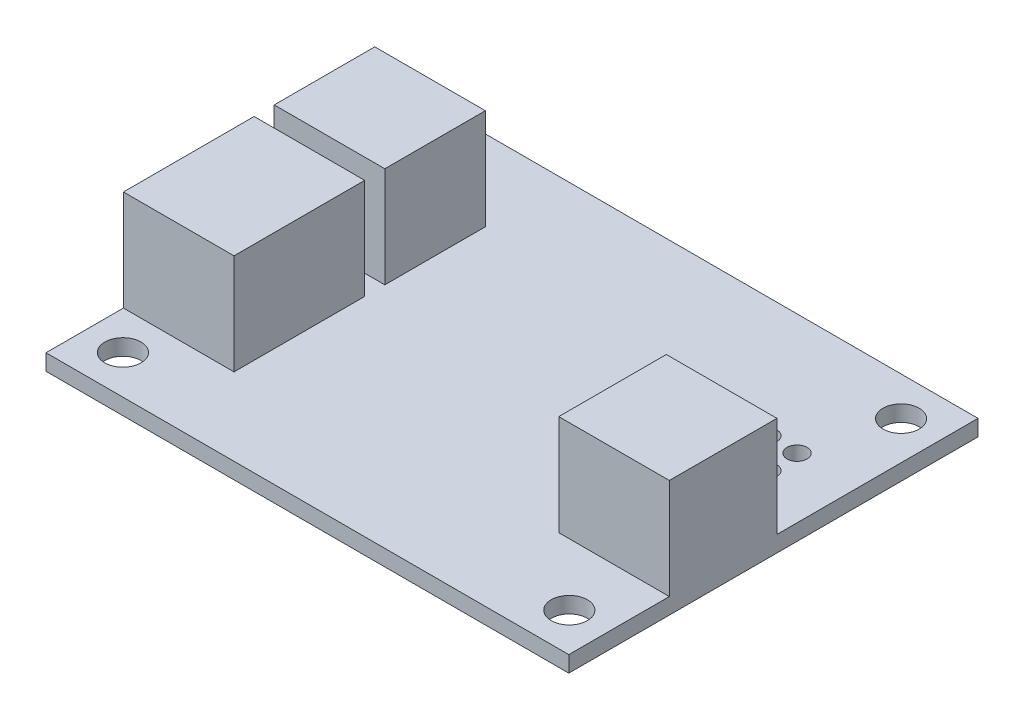
ISO-10303-21;
HEADER;
FILE_DESCRIPTION(('STEP AP214'),'2;1');
FILE_NAME('part.step','',(''),(''),'','','');
FILE_SCHEMA(('AUTOMOTIVE_DESIGN { 1 0 10303 214 1 1 1 1 }'));
ENDSEC;
DATA;
#1=APPLICATION_CONTEXT('core data for automotive mechanical design processes');
#2=APPLICATION_PROTOCOL_DEFINITION('international standard','automotive_design',2000,#1);
#3=PRODUCT_CONTEXT('',#1,'mechanical');
#4=PRODUCT('Part','Part','',(#3));
#5=PRODUCT_RELATED_PRODUCT_CATEGORY('part','',(#4));
#6=PRODUCT_DEFINITION_FORMATION('','',#4);
#7=PRODUCT_DEFINITION_CONTEXT('part definition',#1,'design');
#8=PRODUCT_DEFINITION('design','',#6,#7);
#9=PRODUCT_DEFINITION_SHAPE('','',#8);
#10=(LENGTH_UNIT() NAMED_UNIT(*) SI_UNIT(.MILLI.,.METRE.));
#11=(NAMED_UNIT(*) PLANE_ANGLE_UNIT() SI_UNIT($,.RADIAN.));
#12=(NAMED_UNIT(*) SI_UNIT($,.STERADIAN.) SOLID_ANGLE_UNIT());
#13=UNCERTAINTY_MEASURE_WITH_UNIT(LENGTH_MEASURE(1.E-05),#10,'distance_accuracy_value','');
#14=(GEOMETRIC_REPRESENTATION_CONTEXT(3) GLOBAL_UNCERTAINTY_ASSIGNED_CONTEXT((#13)) GLOBAL_UNIT_ASSIGNED_CONTEXT((#10,
#11,#12)) REPRESENTATION_CONTEXT('',''));
#15=CARTESIAN_POINT('',(0.,0.,0.));
#16=DIRECTION('',(0.,0.,1.));
#17=DIRECTION('',(1.,0.,0.));
#18=AXIS2_PLACEMENT_3D('',#15,#16,#17);
#19=CARTESIAN_POINT('',(0.,1.6,0.));
#20=DIRECTION('',(0.,-1.,0.));
#21=DIRECTION('',(0.,0.,-1.));
#22=AXIS2_PLACEMENT_3D('',#19,#20,#21);
#23=PLANE('',#22);
#24=CARTESIAN_POINT('',(46.,1.6,-28.7));
#25=DIRECTION('',(0.,1.,0.));
#26=DIRECTION('',(0.,0.,1.));
#27=AXIS2_PLACEMENT_3D('',#24,#25,#26);
#28=CIRCLE('',#27,0.999999999999998);
#29=CARTESIAN_POINT('',(46.,1.6,-27.7));
#30=VERTEX_POINT('',#29);
#31=EDGE_CURVE('E459',#30,#30,#28,.T.);
#32=ORIENTED_EDGE('',*,*,#31,.F.);
#33=EDGE_LOOP('',(#32));
#34=FACE_BOUND('',#33,.T.);
#35=CARTESIAN_POINT('',(40.,1.6,-28.7));
#36=DIRECTION('',(0.,1.,0.));
#37=DIRECTION('',(0.,0.,1.));
#38=AXIS2_PLACEMENT_3D('',#35,#36,#37);
#39=CIRCLE('',#38,0.999999999999998);
#40=CARTESIAN_POINT('',(40.,1.6,-27.7));
#41=VERTEX_POINT('',#40);
#42=EDGE_CURVE('E453',#41,#41,#39,.T.);
#43=ORIENTED_EDGE('',*,*,#42,.F.);
#44=EDGE_LOOP('',(#43));
#45=FACE_BOUND('',#44,.T.);
#46=CARTESIAN_POINT('',(43.,1.6,-28.7));
#47=DIRECTION('',(0.,1.,0.));
#48=DIRECTION('',(0.,0.,1.));
#49=AXIS2_PLACEMENT_3D('',#46,#47,#48);
#50=CIRCLE('',#49,0.999999999999998);
#51=CARTESIAN_POINT('',(43.,1.6,-27.7));
#52=VERTEX_POINT('',#51);
#53=EDGE_CURVE('E447',#52,#52,#50,.T.);
#54=ORIENTED_EDGE('',*,*,#53,.F.);
#55=EDGE_LOOP('',(#54));
#56=FACE_BOUND('',#55,.T.);
#57=CARTESIAN_POINT('',(40.,1.6,-25.7));
#58=DIRECTION('',(0.,1.,0.));
#59=DIRECTION('',(0.,0.,1.));
#60=AXIS2_PLACEMENT_3D('',#57,#58,#59);
#61=CIRCLE('',#60,0.999999999999998);
#62=CARTESIAN_POINT('',(40.,1.6,-24.7));
#63=VERTEX_POINT('',#62);
#64=EDGE_CURVE('E439',#63,#63,#61,.T.);
#65=ORIENTED_EDGE('',*,*,#64,.F.);
#66=EDGE_LOOP('',(#65));
#67=FACE_BOUND('',#66,.T.);
#68=CARTESIAN_POINT('',(43.,1.6,-25.7));
#69=DIRECTION('',(0.,1.,0.));
#70=DIRECTION('',(0.,0.,1.));
#71=AXIS2_PLACEMENT_3D('',#68,#69,#70);
#72=CIRCLE('',#71,0.999999999999998);
#73=CARTESIAN_POINT('',(43.,1.6,-24.7));
#74=VERTEX_POINT('',#73);
#75=EDGE_CURVE('E432',#74,#74,#72,.T.);
#76=ORIENTED_EDGE('',*,*,#75,.F.);
#77=EDGE_LOOP('',(#76));
#78=FACE_BOUND('',#77,.T.);
#79=CARTESIAN_POINT('',(46.,1.6,-25.7));
#80=DIRECTION('',(0.,1.,0.));
#81=DIRECTION('',(0.,0.,1.));
#82=AXIS2_PLACEMENT_3D('',#79,#80,#81);
#83=CIRCLE('',#82,0.999999999999998);
#84=CARTESIAN_POINT('',(46.,1.6,-24.7));
#85=VERTEX_POINT('',#84);
#86=EDGE_CURVE('E436',#85,#85,#83,.T.);
#87=ORIENTED_EDGE('',*,*,#86,.F.);
#88=EDGE_LOOP('',(#87));
#89=FACE_BOUND('',#88,.T.);
#90=CARTESIAN_POINT('',(3.8,1.6,-3.85));
#91=DIRECTION('',(0.,1.,0.));
#92=DIRECTION('',(0.,0.,1.));
#93=AXIS2_PLACEMENT_3D('',#90,#91,#92);
#94=CIRCLE('',#93,1.8);
#95=CARTESIAN_POINT('',(3.8,1.6,-2.05));
#96=VERTEX_POINT('',#95);
#97=EDGE_CURVE('E234',#96,#96,#94,.T.);
#98=ORIENTED_EDGE('',*,*,#97,.F.);
#99=EDGE_LOOP('',(#98));
#100=FACE_BOUND('',#99,.T.);
#101=CARTESIAN_POINT('',(48.2,1.6,-3.85));
#102=DIRECTION('',(0.,1.,0.));
#103=DIRECTION('',(0.,0.,1.));
#104=AXIS2_PLACEMENT_3D('',#101,#102,#103);
#105=CIRCLE('',#104,1.8);
#106=CARTESIAN_POINT('',(48.2,1.6,-2.05));
#107=VERTEX_POINT('',#106);
#108=EDGE_CURVE('E240',#107,#107,#105,.T.);
#109=ORIENTED_EDGE('',*,*,#108,.F.);
#110=EDGE_LOOP('',(#109));
#111=FACE_BOUND('',#110,.T.);
#112=CARTESIAN_POINT('',(48.2,1.6,-36.85));
#113=DIRECTION('',(0.,1.,0.));
#114=DIRECTION('',(0.,0.,1.));
#115=AXIS2_PLACEMENT_3D('',#112,#113,#114);
#116=CIRCLE('',#115,1.8);
#117=CARTESIAN_POINT('',(48.2,1.6,-35.05));
#118=VERTEX_POINT('',#117);
#119=EDGE_CURVE('E246',#118,#118,#116,.T.);
#120=ORIENTED_EDGE('',*,*,#119,.F.);
#121=EDGE_LOOP('',(#120));
#122=FACE_BOUND('',#121,.T.);
#123=CARTESIAN_POINT('',(3.8,1.6,-36.85));
#124=DIRECTION('',(0.,1.,0.));
#125=DIRECTION('',(0.,0.,1.));
#126=AXIS2_PLACEMENT_3D('',#123,#124,#125);
#127=CIRCLE('',#126,1.8);
#128=CARTESIAN_POINT('',(3.8,1.6,-35.05));
#129=VERTEX_POINT('',#128);
#130=EDGE_CURVE('E252',#129,#129,#127,.T.);
#131=ORIENTED_EDGE('',*,*,#130,.F.);
#132=EDGE_LOOP('',(#131));
#133=FACE_BOUND('',#132,.T.);
#134=DIRECTION('',(1.,0.,0.));
#135=VECTOR('',#134,1.);
#136=CARTESIAN_POINT('',(0.,1.6,-7.7));
#137=LINE('',#136,#135);
#138=CARTESIAN_POINT('',(0.,1.6,-7.7));
#139=VERTEX_POINT('',#138);
#140=CARTESIAN_POINT('',(11.,1.6,-7.7));
#141=VERTEX_POINT('',#140);
#142=EDGE_CURVE('E314',#139,#141,#137,.T.);
#143=ORIENTED_EDGE('',*,*,#142,.F.);
#144=DIRECTION('',(0.,0.,1.));
#145=VECTOR('',#144,1.);
#146=CARTESIAN_POINT('',(0.,1.6,0.));
#147=LINE('',#146,#145);
#148=CARTESIAN_POINT('',(0.,1.6,0.));
#149=VERTEX_POINT('',#148);
#150=EDGE_CURVE('E167',#139,#149,#147,.T.);
#151=ORIENTED_EDGE('',*,*,#150,.T.);
#152=DIRECTION('',(1.,0.,0.));
#153=VECTOR('',#152,1.);
#154=CARTESIAN_POINT('',(0.,1.6,0.));
#155=LINE('',#154,#153);
#156=CARTESIAN_POINT('',(52.,1.6,0.));
#157=VERTEX_POINT('',#156);
#158=EDGE_CURVE('E260',#149,#157,#155,.T.);
#159=ORIENTED_EDGE('',*,*,#158,.T.);
#160=DIRECTION('',(0.,0.,-1.));
#161=VECTOR('',#160,1.);
#162=CARTESIAN_POINT('',(52.,1.6,0.));
#163=LINE('',#162,#161);
#164=CARTESIAN_POINT('',(52.,1.6,-10.));
#165=VERTEX_POINT('',#164);
#166=EDGE_CURVE('E264',#157,#165,#163,.T.);
#167=ORIENTED_EDGE('',*,*,#166,.T.);
#168=DIRECTION('',(1.,0.,0.));
#169=VECTOR('',#168,1.);
#170=CARTESIAN_POINT('',(52.,1.6,-10.));
#171=LINE('',#170,#169);
#172=CARTESIAN_POINT('',(41.,1.6,-10.));
#173=VERTEX_POINT('',#172);
#174=EDGE_CURVE('E208',#173,#165,#171,.T.);
#175=ORIENTED_EDGE('',*,*,#174,.F.);
#176=DIRECTION('',(0.,0.,1.));
#177=VECTOR('',#176,1.);
#178=CARTESIAN_POINT('',(41.,1.6,-10.));
#179=LINE('',#178,#177);
#180=CARTESIAN_POINT('',(41.,1.6,-20.7));
#181=VERTEX_POINT('',#180);
#182=EDGE_CURVE('E217',#181,#173,#179,.T.);
#183=ORIENTED_EDGE('',*,*,#182,.F.);
#184=DIRECTION('',(-1.,0.,0.));
#185=VECTOR('',#184,1.);
#186=CARTESIAN_POINT('',(52.,1.6,-20.7));
#187=LINE('',#186,#185);
#188=CARTESIAN_POINT('',(52.,1.6,-20.7));
#189=VERTEX_POINT('',#188);
#190=EDGE_CURVE('E203',#189,#181,#187,.T.);
#191=ORIENTED_EDGE('',*,*,#190,.F.);
#192=CARTESIAN_POINT('',(52.,1.6,-40.7));
#193=VERTEX_POINT('',#192);
#194=EDGE_CURVE('E263',#189,#193,#163,.T.);
#195=ORIENTED_EDGE('',*,*,#194,.T.);
#196=DIRECTION('',(-1.,0.,0.));
#197=VECTOR('',#196,1.);
#198=CARTESIAN_POINT('',(0.,1.6,-40.7));
#199=LINE('',#198,#197);
#200=CARTESIAN_POINT('',(0.,1.6,-40.7));
#201=VERTEX_POINT('',#200);
#202=EDGE_CURVE('E266',#193,#201,#199,.T.);
#203=ORIENTED_EDGE('',*,*,#202,.T.);
#204=CARTESIAN_POINT('',(0.,1.6,-32.7));
#205=VERTEX_POINT('',#204);
#206=EDGE_CURVE('E258',#201,#205,#147,.T.);
#207=ORIENTED_EDGE('',*,*,#206,.T.);
#208=DIRECTION('',(-1.,0.,0.));
#209=VECTOR('',#208,1.);
#210=CARTESIAN_POINT('',(0.,1.6,-32.7));
#211=LINE('',#210,#209);
#212=CARTESIAN_POINT('',(11.,1.6,-32.7));
#213=VERTEX_POINT('',#212);
#214=EDGE_CURVE('E181',#213,#205,#211,.T.);
#215=ORIENTED_EDGE('',*,*,#214,.F.);
#216=DIRECTION('',(0.,0.,-1.));
#217=VECTOR('',#216,1.);
#218=CARTESIAN_POINT('',(11.,1.6,-32.7));
#219=LINE('',#218,#217);
#220=CARTESIAN_POINT('',(11.,1.6,-22.7));
#221=VERTEX_POINT('',#220);
#222=EDGE_CURVE('E171',#221,#213,#219,.T.);
#223=ORIENTED_EDGE('',*,*,#222,.F.);
#224=DIRECTION('',(1.,0.,0.));
#225=VECTOR('',#224,1.);
#226=CARTESIAN_POINT('',(0.,1.6,-22.7));
#227=LINE('',#226,#225);
#228=CARTESIAN_POINT('',(0.,1.6,-22.7));
#229=VERTEX_POINT('',#228);
#230=EDGE_CURVE('E168',#229,#221,#227,.T.);
#231=ORIENTED_EDGE('',*,*,#230,.F.);
#232=CARTESIAN_POINT('',(0.,1.6,-20.7));
#233=VERTEX_POINT('',#232);
#234=EDGE_CURVE('E261',#229,#233,#147,.T.);
#235=ORIENTED_EDGE('',*,*,#234,.T.);
#236=DIRECTION('',(-1.,0.,0.));
#237=VECTOR('',#236,1.);
#238=CARTESIAN_POINT('',(0.,1.6,-20.7));
#239=LINE('',#238,#237);
#240=CARTESIAN_POINT('',(11.,1.6,-20.7));
#241=VERTEX_POINT('',#240);
#242=EDGE_CURVE('E53',#241,#233,#239,.T.);
#243=ORIENTED_EDGE('',*,*,#242,.F.);
#244=DIRECTION('',(0.,0.,-1.));
#245=VECTOR('',#244,1.);
#246=CARTESIAN_POINT('',(11.,1.6,-20.7));
#247=LINE('',#246,#245);
#248=EDGE_CURVE('E48',#141,#241,#247,.T.);
#249=ORIENTED_EDGE('',*,*,#248,.F.);
#250=EDGE_LOOP('',(#143,#151,#159,#167,#175,#183,#191,#195,#203,#207,#215,#223,#231,#235,#243,#249));
#251=FACE_BOUND('',#250,.T.);
#252=ADVANCED_FACE('F33',(#34,#45,#56,#67,#78,#89,#100,#111,#122,#133,#251),#23,.F.);
#253=CARTESIAN_POINT('',(0.,0.,0.));
#254=DIRECTION('',(0.,-1.,0.));
#255=DIRECTION('',(0.,0.,-1.));
#256=AXIS2_PLACEMENT_3D('',#253,#254,#255);
#257=PLANE('',#256);
#258=CARTESIAN_POINT('',(46.,0.,-28.7));
#259=DIRECTION('',(0.,1.,0.));
#260=DIRECTION('',(0.,0.,1.));
#261=AXIS2_PLACEMENT_3D('',#258,#259,#260);
#262=CIRCLE('',#261,0.999999999999998);
#263=CARTESIAN_POINT('',(46.,0.,-27.7));
#264=VERTEX_POINT('',#263);
#265=EDGE_CURVE('E456',#264,#264,#262,.T.);
#266=ORIENTED_EDGE('',*,*,#265,.T.);
#267=EDGE_LOOP('',(#266));
#268=FACE_BOUND('',#267,.T.);
#269=CARTESIAN_POINT('',(40.,0.,-28.7));
#270=DIRECTION('',(0.,1.,0.));
#271=DIRECTION('',(0.,0.,1.));
#272=AXIS2_PLACEMENT_3D('',#269,#270,#271);
#273=CIRCLE('',#272,0.999999999999998);
#274=CARTESIAN_POINT('',(40.,0.,-27.7));
#275=VERTEX_POINT('',#274);
#276=EDGE_CURVE('E450',#275,#275,#273,.T.);
#277=ORIENTED_EDGE('',*,*,#276,.T.);
#278=EDGE_LOOP('',(#277));
#279=FACE_BOUND('',#278,.T.);
#280=CARTESIAN_POINT('',(43.,0.,-28.7));
#281=DIRECTION('',(0.,1.,0.));
#282=DIRECTION('',(0.,0.,1.));
#283=AXIS2_PLACEMENT_3D('',#280,#281,#282);
#284=CIRCLE('',#283,0.999999999999998);
#285=CARTESIAN_POINT('',(43.,0.,-27.7));
#286=VERTEX_POINT('',#285);
#287=EDGE_CURVE('E444',#286,#286,#284,.T.);
#288=ORIENTED_EDGE('',*,*,#287,.T.);
#289=EDGE_LOOP('',(#288));
#290=FACE_BOUND('',#289,.T.);
#291=CARTESIAN_POINT('',(40.,0.,-25.7));
#292=DIRECTION('',(0.,1.,0.));
#293=DIRECTION('',(0.,0.,1.));
#294=AXIS2_PLACEMENT_3D('',#291,#292,#293);
#295=CIRCLE('',#294,0.999999999999998);
#296=CARTESIAN_POINT('',(40.,0.,-24.7));
#297=VERTEX_POINT('',#296);
#298=EDGE_CURVE('E434',#297,#297,#295,.T.);
#299=ORIENTED_EDGE('',*,*,#298,.T.);
#300=EDGE_LOOP('',(#299));
#301=FACE_BOUND('',#300,.T.);
#302=CARTESIAN_POINT('',(43.,0.,-25.7));
#303=DIRECTION('',(0.,1.,0.));
#304=DIRECTION('',(0.,0.,1.));
#305=AXIS2_PLACEMENT_3D('',#302,#303,#304);
#306=CIRCLE('',#305,0.999999999999998);
#307=CARTESIAN_POINT('',(43.,0.,-24.7));
#308=VERTEX_POINT('',#307);
#309=EDGE_CURVE('E429',#308,#308,#306,.T.);
#310=ORIENTED_EDGE('',*,*,#309,.T.);
#311=EDGE_LOOP('',(#310));
#312=FACE_BOUND('',#311,.T.);
#313=CARTESIAN_POINT('',(46.,0.,-25.7));
#314=DIRECTION('',(0.,1.,0.));
#315=DIRECTION('',(0.,0.,1.));
#316=AXIS2_PLACEMENT_3D('',#313,#314,#315);
#317=CIRCLE('',#316,0.999999999999998);
#318=CARTESIAN_POINT('',(46.,0.,-24.7));
#319=VERTEX_POINT('',#318);
#320=EDGE_CURVE('E462',#319,#319,#317,.T.);
#321=ORIENTED_EDGE('',*,*,#320,.T.);
#322=EDGE_LOOP('',(#321));
#323=FACE_BOUND('',#322,.T.);
#324=CARTESIAN_POINT('',(48.2,0.,-3.85));
#325=DIRECTION('',(0.,1.,0.));
#326=DIRECTION('',(0.,0.,1.));
#327=AXIS2_PLACEMENT_3D('',#324,#325,#326);
#328=CIRCLE('',#327,1.8);
#329=CARTESIAN_POINT('',(48.2,0.,-2.05));
#330=VERTEX_POINT('',#329);
#331=EDGE_CURVE('E237',#330,#330,#328,.T.);
#332=ORIENTED_EDGE('',*,*,#331,.T.);
#333=EDGE_LOOP('',(#332));
#334=FACE_BOUND('',#333,.T.);
#335=CARTESIAN_POINT('',(3.8,0.,-36.85));
#336=DIRECTION('',(0.,1.,0.));
#337=DIRECTION('',(0.,0.,1.));
#338=AXIS2_PLACEMENT_3D('',#335,#336,#337);
#339=CIRCLE('',#338,1.8);
#340=CARTESIAN_POINT('',(3.8,0.,-35.05));
#341=VERTEX_POINT('',#340);
#342=EDGE_CURVE('E249',#341,#341,#339,.T.);
#343=ORIENTED_EDGE('',*,*,#342,.T.);
#344=EDGE_LOOP('',(#343));
#345=FACE_BOUND('',#344,.T.);
#346=DIRECTION('',(0.,0.,1.));
#347=VECTOR('',#346,1.);
#348=CARTESIAN_POINT('',(0.,0.,0.));
#349=LINE('',#348,#347);
#350=CARTESIAN_POINT('',(0.,0.,-40.7));
#351=VERTEX_POINT('',#350);
#352=CARTESIAN_POINT('',(0.,0.,0.));
#353=VERTEX_POINT('',#352);
#354=EDGE_CURVE('E255',#351,#353,#349,.T.);
#355=ORIENTED_EDGE('',*,*,#354,.F.);
#356=DIRECTION('',(-1.,0.,0.));
#357=VECTOR('',#356,1.);
#358=CARTESIAN_POINT('',(0.,0.,-40.7));
#359=LINE('',#358,#357);
#360=CARTESIAN_POINT('',(52.,0.,-40.7));
#361=VERTEX_POINT('',#360);
#362=EDGE_CURVE('E274',#361,#351,#359,.T.);
#363=ORIENTED_EDGE('',*,*,#362,.F.);
#364=DIRECTION('',(0.,0.,-1.));
#365=VECTOR('',#364,1.);
#366=CARTESIAN_POINT('',(52.,0.,0.));
#367=LINE('',#366,#365);
#368=CARTESIAN_POINT('',(52.,0.,0.));
#369=VERTEX_POINT('',#368);
#370=EDGE_CURVE('E272',#369,#361,#367,.T.);
#371=ORIENTED_EDGE('',*,*,#370,.F.);
#372=DIRECTION('',(1.,0.,0.));
#373=VECTOR('',#372,1.);
#374=CARTESIAN_POINT('',(0.,0.,0.));
#375=LINE('',#374,#373);
#376=EDGE_CURVE('E270',#353,#369,#375,.T.);
#377=ORIENTED_EDGE('',*,*,#376,.F.);
#378=EDGE_LOOP('',(#355,#363,#371,#377));
#379=FACE_BOUND('',#378,.T.);
#380=CARTESIAN_POINT('',(48.2,0.,-36.85));
#381=DIRECTION('',(0.,1.,0.));
#382=DIRECTION('',(0.,0.,1.));
#383=AXIS2_PLACEMENT_3D('',#380,#381,#382);
#384=CIRCLE('',#383,1.8);
#385=CARTESIAN_POINT('',(48.2,0.,-35.05));
#386=VERTEX_POINT('',#385);
#387=EDGE_CURVE('E243',#386,#386,#384,.T.);
#388=ORIENTED_EDGE('',*,*,#387,.T.);
#389=EDGE_LOOP('',(#388));
#390=FACE_BOUND('',#389,.T.);
#391=CARTESIAN_POINT('',(3.8,0.,-3.85));
#392=DIRECTION('',(0.,1.,0.));
#393=DIRECTION('',(0.,0.,1.));
#394=AXIS2_PLACEMENT_3D('',#391,#392,#393);
#395=CIRCLE('',#394,1.8);
#396=CARTESIAN_POINT('',(3.8,0.,-2.05));
#397=VERTEX_POINT('',#396);
#398=EDGE_CURVE('E233',#397,#397,#395,.T.);
#399=ORIENTED_EDGE('',*,*,#398,.T.);
#400=EDGE_LOOP('',(#399));
#401=FACE_BOUND('',#400,.T.);
#402=ADVANCED_FACE('F292',(#268,#279,#290,#301,#312,#323,#334,#345,#379,#390,#401),#257,.T.);
#403=CARTESIAN_POINT('',(0.,1.6,0.));
#404=DIRECTION('',(1.,0.,0.));
#405=DIRECTION('',(0.,0.,-1.));
#406=AXIS2_PLACEMENT_3D('',#403,#404,#405);
#407=PLANE('',#406);
#408=ORIENTED_EDGE('',*,*,#354,.T.);
#409=DIRECTION('',(0.,-1.,0.));
#410=VECTOR('',#409,1.);
#411=CARTESIAN_POINT('',(0.,1.6,0.));
#412=LINE('',#411,#410);
#413=EDGE_CURVE('E11',#149,#353,#412,.T.);
#414=ORIENTED_EDGE('',*,*,#413,.F.);
#415=ORIENTED_EDGE('',*,*,#150,.F.);
#416=DIRECTION('',(0.,-1.,0.));
#417=VECTOR('',#416,1.);
#418=CARTESIAN_POINT('',(0.,11.6,-7.7));
#419=LINE('',#418,#417);
#420=CARTESIAN_POINT('',(0.,11.6,-7.7));
#421=VERTEX_POINT('',#420);
#422=EDGE_CURVE('E149',#421,#139,#419,.T.);
#423=ORIENTED_EDGE('',*,*,#422,.F.);
#424=DIRECTION('',(0.,0.,1.));
#425=VECTOR('',#424,1.);
#426=CARTESIAN_POINT('',(0.,11.6,-20.7));
#427=LINE('',#426,#425);
#428=CARTESIAN_POINT('',(0.,11.6,-20.7));
#429=VERTEX_POINT('',#428);
#430=EDGE_CURVE('E155',#429,#421,#427,.T.);
#431=ORIENTED_EDGE('',*,*,#430,.F.);
#432=DIRECTION('',(0.,-1.,0.));
#433=VECTOR('',#432,1.);
#434=CARTESIAN_POINT('',(0.,11.6,-20.7));
#435=LINE('',#434,#433);
#436=EDGE_CURVE('E313',#429,#233,#435,.T.);
#437=ORIENTED_EDGE('',*,*,#436,.T.);
#438=ORIENTED_EDGE('',*,*,#234,.F.);
#439=DIRECTION('',(0.,-1.,0.));
#440=VECTOR('',#439,1.);
#441=CARTESIAN_POINT('',(0.,11.6,-22.7));
#442=LINE('',#441,#440);
#443=CARTESIAN_POINT('',(0.,11.6,-22.7));
#444=VERTEX_POINT('',#443);
#445=EDGE_CURVE('E200',#444,#229,#442,.T.);
#446=ORIENTED_EDGE('',*,*,#445,.F.);
#447=DIRECTION('',(0.,0.,1.));
#448=VECTOR('',#447,1.);
#449=CARTESIAN_POINT('',(0.,11.6,-32.7));
#450=LINE('',#449,#448);
#451=CARTESIAN_POINT('',(0.,11.6,-32.7));
#452=VERTEX_POINT('',#451);
#453=EDGE_CURVE('E177',#452,#444,#450,.T.);
#454=ORIENTED_EDGE('',*,*,#453,.F.);
#455=DIRECTION('',(0.,-1.,0.));
#456=VECTOR('',#455,1.);
#457=CARTESIAN_POINT('',(0.,11.6,-32.7));
#458=LINE('',#457,#456);
#459=EDGE_CURVE('E186',#452,#205,#458,.T.);
#460=ORIENTED_EDGE('',*,*,#459,.T.);
#461=ORIENTED_EDGE('',*,*,#206,.F.);
#462=DIRECTION('',(0.,-1.,0.));
#463=VECTOR('',#462,1.);
#464=CARTESIAN_POINT('',(0.,1.6,-40.7));
#465=LINE('',#464,#463);
#466=EDGE_CURVE('E268',#201,#351,#465,.T.);
#467=ORIENTED_EDGE('',*,*,#466,.T.);
#468=EDGE_LOOP('',(#408,#414,#415,#423,#431,#437,#438,#446,#454,#460,#461,#467));
#469=FACE_BOUND('',#468,.T.);
#470=ADVANCED_FACE('F35',(#469),#407,.F.);
#471=CARTESIAN_POINT('',(0.,1.6,0.));
#472=DIRECTION('',(0.,0.,-1.));
#473=DIRECTION('',(-1.,0.,0.));
#474=AXIS2_PLACEMENT_3D('',#471,#472,#473);
#475=PLANE('',#474);
#476=ORIENTED_EDGE('',*,*,#376,.T.);
#477=DIRECTION('',(0.,-1.,0.));
#478=VECTOR('',#477,1.);
#479=CARTESIAN_POINT('',(52.,1.6,0.));
#480=LINE('',#479,#478);
#481=EDGE_CURVE('E41',#157,#369,#480,.T.);
#482=ORIENTED_EDGE('',*,*,#481,.F.);
#483=ORIENTED_EDGE('',*,*,#158,.F.);
#484=ORIENTED_EDGE('',*,*,#413,.T.);
#485=EDGE_LOOP('',(#476,#482,#483,#484));
#486=FACE_BOUND('',#485,.T.);
#487=ADVANCED_FACE('F315',(#486),#475,.F.);
#488=CARTESIAN_POINT('',(52.,1.6,0.));
#489=DIRECTION('',(-1.,0.,0.));
#490=DIRECTION('',(0.,0.,1.));
#491=AXIS2_PLACEMENT_3D('',#488,#489,#490);
#492=PLANE('',#491);
#493=ORIENTED_EDGE('',*,*,#370,.T.);
#494=DIRECTION('',(0.,-1.,0.));
#495=VECTOR('',#494,1.);
#496=CARTESIAN_POINT('',(52.,1.6,-40.7));
#497=LINE('',#496,#495);
#498=EDGE_CURVE('E278',#193,#361,#497,.T.);
#499=ORIENTED_EDGE('',*,*,#498,.F.);
#500=ORIENTED_EDGE('',*,*,#194,.F.);
#501=DIRECTION('',(0.,-1.,0.));
#502=VECTOR('',#501,1.);
#503=CARTESIAN_POINT('',(52.,11.6,-20.7));
#504=LINE('',#503,#502);
#505=CARTESIAN_POINT('',(52.,11.6,-20.7));
#506=VERTEX_POINT('',#505);
#507=EDGE_CURVE('E230',#506,#189,#504,.T.);
#508=ORIENTED_EDGE('',*,*,#507,.F.);
#509=DIRECTION('',(0.,0.,-1.));
#510=VECTOR('',#509,1.);
#511=CARTESIAN_POINT('',(52.,11.6,-10.));
#512=LINE('',#511,#510);
#513=CARTESIAN_POINT('',(52.,11.6,-10.));
#514=VERTEX_POINT('',#513);
#515=EDGE_CURVE('E204',#514,#506,#512,.T.);
#516=ORIENTED_EDGE('',*,*,#515,.F.);
#517=DIRECTION('',(0.,-1.,0.));
#518=VECTOR('',#517,1.);
#519=CARTESIAN_POINT('',(52.,11.6,-10.));
#520=LINE('',#519,#518);
#521=EDGE_CURVE('E214',#514,#165,#520,.T.);
#522=ORIENTED_EDGE('',*,*,#521,.T.);
#523=ORIENTED_EDGE('',*,*,#166,.F.);
#524=ORIENTED_EDGE('',*,*,#481,.T.);
#525=EDGE_LOOP('',(#493,#499,#500,#508,#516,#522,#523,#524));
#526=FACE_BOUND('',#525,.T.);
#527=ADVANCED_FACE('F285',(#526),#492,.F.);
#528=CARTESIAN_POINT('',(0.,1.6,-40.7));
#529=DIRECTION('',(0.,0.,1.));
#530=DIRECTION('',(1.,0.,0.));
#531=AXIS2_PLACEMENT_3D('',#528,#529,#530);
#532=PLANE('',#531);
#533=ORIENTED_EDGE('',*,*,#362,.T.);
#534=ORIENTED_EDGE('',*,*,#466,.F.);
#535=ORIENTED_EDGE('',*,*,#202,.F.);
#536=ORIENTED_EDGE('',*,*,#498,.T.);
#537=EDGE_LOOP('',(#533,#534,#535,#536));
#538=FACE_BOUND('',#537,.T.);
#539=ADVANCED_FACE('F296',(#538),#532,.F.);
#540=CARTESIAN_POINT('',(3.8,1.6,-36.85));
#541=DIRECTION('',(0.,-1.,0.));
#542=DIRECTION('',(0.,0.,-1.));
#543=AXIS2_PLACEMENT_3D('',#540,#541,#542);
#544=CYLINDRICAL_SURFACE('',#543,1.8);
#545=ORIENTED_EDGE('',*,*,#130,.T.);
#546=EDGE_LOOP('',(#545));
#547=FACE_BOUND('',#546,.T.);
#548=ORIENTED_EDGE('',*,*,#342,.F.);
#549=EDGE_LOOP('',(#548));
#550=FACE_BOUND('',#549,.T.);
#551=ADVANCED_FACE('F333',(#547,#550),#544,.F.);
#552=CARTESIAN_POINT('',(48.2,1.6,-36.85));
#553=DIRECTION('',(0.,-1.,0.));
#554=DIRECTION('',(0.,0.,-1.));
#555=AXIS2_PLACEMENT_3D('',#552,#553,#554);
#556=CYLINDRICAL_SURFACE('',#555,1.8);
#557=ORIENTED_EDGE('',*,*,#119,.T.);
#558=EDGE_LOOP('',(#557));
#559=FACE_BOUND('',#558,.T.);
#560=ORIENTED_EDGE('',*,*,#387,.F.);
#561=EDGE_LOOP('',(#560));
#562=FACE_BOUND('',#561,.T.);
#563=ADVANCED_FACE('F340',(#559,#562),#556,.F.);
#564=CARTESIAN_POINT('',(48.2,1.6,-3.85));
#565=DIRECTION('',(0.,-1.,0.));
#566=DIRECTION('',(0.,0.,-1.));
#567=AXIS2_PLACEMENT_3D('',#564,#565,#566);
#568=CYLINDRICAL_SURFACE('',#567,1.8);
#569=ORIENTED_EDGE('',*,*,#108,.T.);
#570=EDGE_LOOP('',(#569));
#571=FACE_BOUND('',#570,.T.);
#572=ORIENTED_EDGE('',*,*,#331,.F.);
#573=EDGE_LOOP('',(#572));
#574=FACE_BOUND('',#573,.T.);
#575=ADVANCED_FACE('F345',(#571,#574),#568,.F.);
#576=CARTESIAN_POINT('',(3.8,1.6,-3.85));
#577=DIRECTION('',(0.,-1.,0.));
#578=DIRECTION('',(0.,0.,-1.));
#579=AXIS2_PLACEMENT_3D('',#576,#577,#578);
#580=CYLINDRICAL_SURFACE('',#579,1.8);
#581=ORIENTED_EDGE('',*,*,#97,.T.);
#582=EDGE_LOOP('',(#581));
#583=FACE_BOUND('',#582,.T.);
#584=ORIENTED_EDGE('',*,*,#398,.F.);
#585=EDGE_LOOP('',(#584));
#586=FACE_BOUND('',#585,.T.);
#587=ADVANCED_FACE('F355',(#583,#586),#580,.F.);
#588=CARTESIAN_POINT('',(52.,11.6,-20.7));
#589=DIRECTION('',(0.,0.,1.));
#590=DIRECTION('',(1.,0.,0.));
#591=AXIS2_PLACEMENT_3D('',#588,#589,#590);
#592=PLANE('',#591);
#593=ORIENTED_EDGE('',*,*,#190,.T.);
#594=DIRECTION('',(0.,-1.,0.));
#595=VECTOR('',#594,1.);
#596=CARTESIAN_POINT('',(41.,11.6,-20.7));
#597=LINE('',#596,#595);
#598=CARTESIAN_POINT('',(41.,11.6,-20.7));
#599=VERTEX_POINT('',#598);
#600=EDGE_CURVE('E227',#599,#181,#597,.T.);
#601=ORIENTED_EDGE('',*,*,#600,.F.);
#602=DIRECTION('',(-1.,0.,0.));
#603=VECTOR('',#602,1.);
#604=CARTESIAN_POINT('',(52.,11.6,-20.7));
#605=LINE('',#604,#603);
#606=EDGE_CURVE('E207',#506,#599,#605,.T.);
#607=ORIENTED_EDGE('',*,*,#606,.F.);
#608=ORIENTED_EDGE('',*,*,#507,.T.);
#609=EDGE_LOOP('',(#593,#601,#607,#608));
#610=FACE_BOUND('',#609,.T.);
#611=ADVANCED_FACE('F362',(#610),#592,.F.);
#612=CARTESIAN_POINT('',(41.,11.6,-10.));
#613=DIRECTION('',(1.,0.,0.));
#614=DIRECTION('',(0.,0.,-1.));
#615=AXIS2_PLACEMENT_3D('',#612,#613,#614);
#616=PLANE('',#615);
#617=ORIENTED_EDGE('',*,*,#182,.T.);
#618=DIRECTION('',(0.,-1.,0.));
#619=VECTOR('',#618,1.);
#620=CARTESIAN_POINT('',(41.,11.6,-10.));
#621=LINE('',#620,#619);
#622=CARTESIAN_POINT('',(41.,11.6,-10.));
#623=VERTEX_POINT('',#622);
#624=EDGE_CURVE('E224',#623,#173,#621,.T.);
#625=ORIENTED_EDGE('',*,*,#624,.F.);
#626=DIRECTION('',(0.,0.,1.));
#627=VECTOR('',#626,1.);
#628=CARTESIAN_POINT('',(41.,11.6,-10.));
#629=LINE('',#628,#627);
#630=EDGE_CURVE('E210',#599,#623,#629,.T.);
#631=ORIENTED_EDGE('',*,*,#630,.F.);
#632=ORIENTED_EDGE('',*,*,#600,.T.);
#633=EDGE_LOOP('',(#617,#625,#631,#632));
#634=FACE_BOUND('',#633,.T.);
#635=ADVANCED_FACE('F366',(#634),#616,.F.);
#636=CARTESIAN_POINT('',(52.,11.6,-10.));
#637=DIRECTION('',(0.,0.,-1.));
#638=DIRECTION('',(-1.,0.,0.));
#639=AXIS2_PLACEMENT_3D('',#636,#637,#638);
#640=PLANE('',#639);
#641=ORIENTED_EDGE('',*,*,#174,.T.);
#642=ORIENTED_EDGE('',*,*,#521,.F.);
#643=DIRECTION('',(1.,0.,0.));
#644=VECTOR('',#643,1.);
#645=CARTESIAN_POINT('',(52.,11.6,-10.));
#646=LINE('',#645,#644);
#647=EDGE_CURVE('E212',#623,#514,#646,.T.);
#648=ORIENTED_EDGE('',*,*,#647,.F.);
#649=ORIENTED_EDGE('',*,*,#624,.T.);
#650=EDGE_LOOP('',(#641,#642,#648,#649));
#651=FACE_BOUND('',#650,.T.);
#652=ADVANCED_FACE('F370',(#651),#640,.F.);
#653=CARTESIAN_POINT('',(0.,11.6,0.));
#654=DIRECTION('',(0.,1.,0.));
#655=DIRECTION('',(0.,0.,1.));
#656=AXIS2_PLACEMENT_3D('',#653,#654,#655);
#657=PLANE('',#656);
#658=ORIENTED_EDGE('',*,*,#515,.T.);
#659=ORIENTED_EDGE('',*,*,#606,.T.);
#660=ORIENTED_EDGE('',*,*,#630,.T.);
#661=ORIENTED_EDGE('',*,*,#647,.T.);
#662=EDGE_LOOP('',(#658,#659,#660,#661));
#663=FACE_BOUND('',#662,.T.);
#664=ADVANCED_FACE('F374',(#663),#657,.T.);
#665=CARTESIAN_POINT('',(0.,11.6,-22.7));
#666=DIRECTION('',(0.,0.,-1.));
#667=DIRECTION('',(-1.,0.,0.));
#668=AXIS2_PLACEMENT_3D('',#665,#666,#667);
#669=PLANE('',#668);
#670=ORIENTED_EDGE('',*,*,#230,.T.);
#671=DIRECTION('',(0.,-1.,0.));
#672=VECTOR('',#671,1.);
#673=CARTESIAN_POINT('',(11.,11.6,-22.7));
#674=LINE('',#673,#672);
#675=CARTESIAN_POINT('',(11.,11.6,-22.7));
#676=VERTEX_POINT('',#675);
#677=EDGE_CURVE('E197',#676,#221,#674,.T.);
#678=ORIENTED_EDGE('',*,*,#677,.F.);
#679=DIRECTION('',(1.,0.,0.));
#680=VECTOR('',#679,1.);
#681=CARTESIAN_POINT('',(0.,11.6,-22.7));
#682=LINE('',#681,#680);
#683=EDGE_CURVE('E180',#444,#676,#682,.T.);
#684=ORIENTED_EDGE('',*,*,#683,.F.);
#685=ORIENTED_EDGE('',*,*,#445,.T.);
#686=EDGE_LOOP('',(#670,#678,#684,#685));
#687=FACE_BOUND('',#686,.T.);
#688=ADVANCED_FACE('F311',(#687),#669,.F.);
#689=CARTESIAN_POINT('',(11.,11.6,-32.7));
#690=DIRECTION('',(-1.,0.,0.));
#691=DIRECTION('',(0.,0.,1.));
#692=AXIS2_PLACEMENT_3D('',#689,#690,#691);
#693=PLANE('',#692);
#694=ORIENTED_EDGE('',*,*,#222,.T.);
#695=DIRECTION('',(0.,-1.,0.));
#696=VECTOR('',#695,1.);
#697=CARTESIAN_POINT('',(11.,11.6,-32.7));
#698=LINE('',#697,#696);
#699=CARTESIAN_POINT('',(11.,11.6,-32.7));
#700=VERTEX_POINT('',#699);
#701=EDGE_CURVE('E194',#700,#213,#698,.T.);
#702=ORIENTED_EDGE('',*,*,#701,.F.);
#703=DIRECTION('',(0.,0.,-1.));
#704=VECTOR('',#703,1.);
#705=CARTESIAN_POINT('',(11.,11.6,-32.7));
#706=LINE('',#705,#704);
#707=EDGE_CURVE('E183',#676,#700,#706,.T.);
#708=ORIENTED_EDGE('',*,*,#707,.F.);
#709=ORIENTED_EDGE('',*,*,#677,.T.);
#710=EDGE_LOOP('',(#694,#702,#708,#709));
#711=FACE_BOUND('',#710,.T.);
#712=ADVANCED_FACE('F307',(#711),#693,.F.);
#713=CARTESIAN_POINT('',(0.,11.6,-32.7));
#714=DIRECTION('',(0.,0.,1.));
#715=DIRECTION('',(1.,0.,0.));
#716=AXIS2_PLACEMENT_3D('',#713,#714,#715);
#717=PLANE('',#716);
#718=ORIENTED_EDGE('',*,*,#214,.T.);
#719=ORIENTED_EDGE('',*,*,#459,.F.);
#720=DIRECTION('',(-1.,0.,0.));
#721=VECTOR('',#720,1.);
#722=CARTESIAN_POINT('',(0.,11.6,-32.7));
#723=LINE('',#722,#721);
#724=EDGE_CURVE('E185',#700,#452,#723,.T.);
#725=ORIENTED_EDGE('',*,*,#724,.F.);
#726=ORIENTED_EDGE('',*,*,#701,.T.);
#727=EDGE_LOOP('',(#718,#719,#725,#726));
#728=FACE_BOUND('',#727,.T.);
#729=ADVANCED_FACE('F302',(#728),#717,.F.);
#730=CARTESIAN_POINT('',(0.,11.6,0.));
#731=DIRECTION('',(0.,1.,0.));
#732=DIRECTION('',(0.,0.,1.));
#733=AXIS2_PLACEMENT_3D('',#730,#731,#732);
#734=PLANE('',#733);
#735=ORIENTED_EDGE('',*,*,#453,.T.);
#736=ORIENTED_EDGE('',*,*,#683,.T.);
#737=ORIENTED_EDGE('',*,*,#707,.T.);
#738=ORIENTED_EDGE('',*,*,#724,.T.);
#739=EDGE_LOOP('',(#735,#736,#737,#738));
#740=FACE_BOUND('',#739,.T.);
#741=ADVANCED_FACE('F385',(#740),#734,.T.);
#742=CARTESIAN_POINT('',(0.,11.6,-7.7));
#743=DIRECTION('',(0.,0.,-1.));
#744=DIRECTION('',(-1.,0.,0.));
#745=AXIS2_PLACEMENT_3D('',#742,#743,#744);
#746=PLANE('',#745);
#747=ORIENTED_EDGE('',*,*,#142,.T.);
#748=DIRECTION('',(0.,-1.,0.));
#749=VECTOR('',#748,1.);
#750=CARTESIAN_POINT('',(11.,11.6,-7.7));
#751=LINE('',#750,#749);
#752=CARTESIAN_POINT('',(11.,11.6,-7.7));
#753=VERTEX_POINT('',#752);
#754=EDGE_CURVE('E151',#753,#141,#751,.T.);
#755=ORIENTED_EDGE('',*,*,#754,.F.);
#756=DIRECTION('',(1.,0.,0.));
#757=VECTOR('',#756,1.);
#758=CARTESIAN_POINT('',(0.,11.6,-7.7));
#759=LINE('',#758,#757);
#760=EDGE_CURVE('E145',#421,#753,#759,.T.);
#761=ORIENTED_EDGE('',*,*,#760,.F.);
#762=ORIENTED_EDGE('',*,*,#422,.T.);
#763=EDGE_LOOP('',(#747,#755,#761,#762));
#764=FACE_BOUND('',#763,.T.);
#765=ADVANCED_FACE('F147',(#764),#746,.F.);
#766=CARTESIAN_POINT('',(11.,11.6,-20.7));
#767=DIRECTION('',(-1.,0.,0.));
#768=DIRECTION('',(0.,0.,1.));
#769=AXIS2_PLACEMENT_3D('',#766,#767,#768);
#770=PLANE('',#769);
#771=ORIENTED_EDGE('',*,*,#248,.T.);
#772=DIRECTION('',(0.,-1.,0.));
#773=VECTOR('',#772,1.);
#774=CARTESIAN_POINT('',(11.,11.6,-20.7));
#775=LINE('',#774,#773);
#776=CARTESIAN_POINT('',(11.,11.6,-20.7));
#777=VERTEX_POINT('',#776);
#778=EDGE_CURVE('E173',#777,#241,#775,.T.);
#779=ORIENTED_EDGE('',*,*,#778,.F.);
#780=DIRECTION('',(0.,0.,-1.));
#781=VECTOR('',#780,1.);
#782=CARTESIAN_POINT('',(11.,11.6,-20.7));
#783=LINE('',#782,#781);
#784=EDGE_CURVE('E154',#753,#777,#783,.T.);
#785=ORIENTED_EDGE('',*,*,#784,.F.);
#786=ORIENTED_EDGE('',*,*,#754,.T.);
#787=EDGE_LOOP('',(#771,#779,#785,#786));
#788=FACE_BOUND('',#787,.T.);
#789=ADVANCED_FACE('F391',(#788),#770,.F.);
#790=CARTESIAN_POINT('',(0.,11.6,-20.7));
#791=DIRECTION('',(0.,0.,1.));
#792=DIRECTION('',(1.,0.,0.));
#793=AXIS2_PLACEMENT_3D('',#790,#791,#792);
#794=PLANE('',#793);
#795=ORIENTED_EDGE('',*,*,#242,.T.);
#796=ORIENTED_EDGE('',*,*,#436,.F.);
#797=DIRECTION('',(-1.,0.,0.));
#798=VECTOR('',#797,1.);
#799=CARTESIAN_POINT('',(0.,11.6,-20.7));
#800=LINE('',#799,#798);
#801=EDGE_CURVE('E160',#777,#429,#800,.T.);
#802=ORIENTED_EDGE('',*,*,#801,.F.);
#803=ORIENTED_EDGE('',*,*,#778,.T.);
#804=EDGE_LOOP('',(#795,#796,#802,#803));
#805=FACE_BOUND('',#804,.T.);
#806=ADVANCED_FACE('F394',(#805),#794,.F.);
#807=CARTESIAN_POINT('',(0.,11.6,0.));
#808=DIRECTION('',(0.,1.,0.));
#809=DIRECTION('',(0.,0.,1.));
#810=AXIS2_PLACEMENT_3D('',#807,#808,#809);
#811=PLANE('',#810);
#812=ORIENTED_EDGE('',*,*,#430,.T.);
#813=ORIENTED_EDGE('',*,*,#760,.T.);
#814=ORIENTED_EDGE('',*,*,#784,.T.);
#815=ORIENTED_EDGE('',*,*,#801,.T.);
#816=EDGE_LOOP('',(#812,#813,#814,#815));
#817=FACE_BOUND('',#816,.T.);
#818=ADVANCED_FACE('F158',(#817),#811,.T.);
#819=CARTESIAN_POINT('',(46.,0.,-25.7));
#820=DIRECTION('',(0.,1.,0.));
#821=DIRECTION('',(0.,0.,1.));
#822=AXIS2_PLACEMENT_3D('',#819,#820,#821);
#823=CYLINDRICAL_SURFACE('',#822,0.999999999999998);
#824=ORIENTED_EDGE('',*,*,#320,.F.);
#825=EDGE_LOOP('',(#824));
#826=FACE_BOUND('',#825,.T.);
#827=ORIENTED_EDGE('',*,*,#86,.T.);
#828=EDGE_LOOP('',(#827));
#829=FACE_BOUND('',#828,.T.);
#830=ADVANCED_FACE('F401',(#826,#829),#823,.F.);
#831=CARTESIAN_POINT('',(43.,0.,-25.7));
#832=DIRECTION('',(0.,1.,0.));
#833=DIRECTION('',(0.,0.,1.));
#834=AXIS2_PLACEMENT_3D('',#831,#832,#833);
#835=CYLINDRICAL_SURFACE('',#834,0.999999999999998);
#836=ORIENTED_EDGE('',*,*,#309,.F.);
#837=EDGE_LOOP('',(#836));
#838=FACE_BOUND('',#837,.T.);
#839=ORIENTED_EDGE('',*,*,#75,.T.);
#840=EDGE_LOOP('',(#839));
#841=FACE_BOUND('',#840,.T.);
#842=ADVANCED_FACE('F404',(#838,#841),#835,.F.);
#843=CARTESIAN_POINT('',(40.,0.,-25.7));
#844=DIRECTION('',(0.,1.,0.));
#845=DIRECTION('',(0.,0.,1.));
#846=AXIS2_PLACEMENT_3D('',#843,#844,#845);
#847=CYLINDRICAL_SURFACE('',#846,0.999999999999998);
#848=ORIENTED_EDGE('',*,*,#298,.F.);
#849=EDGE_LOOP('',(#848));
#850=FACE_BOUND('',#849,.T.);
#851=ORIENTED_EDGE('',*,*,#64,.T.);
#852=EDGE_LOOP('',(#851));
#853=FACE_BOUND('',#852,.T.);
#854=ADVANCED_FACE('F417',(#850,#853),#847,.F.);
#855=CARTESIAN_POINT('',(43.,0.,-28.7));
#856=DIRECTION('',(0.,1.,0.));
#857=DIRECTION('',(0.,0.,1.));
#858=AXIS2_PLACEMENT_3D('',#855,#856,#857);
#859=CYLINDRICAL_SURFACE('',#858,0.999999999999998);
#860=ORIENTED_EDGE('',*,*,#287,.F.);
#861=EDGE_LOOP('',(#860));
#862=FACE_BOUND('',#861,.T.);
#863=ORIENTED_EDGE('',*,*,#53,.T.);
#864=EDGE_LOOP('',(#863));
#865=FACE_BOUND('',#864,.T.);
#866=ADVANCED_FACE('F413',(#862,#865),#859,.F.);
#867=CARTESIAN_POINT('',(40.,0.,-28.7));
#868=DIRECTION('',(0.,1.,0.));
#869=DIRECTION('',(0.,0.,1.));
#870=AXIS2_PLACEMENT_3D('',#867,#868,#869);
#871=CYLINDRICAL_SURFACE('',#870,0.999999999999998);
#872=ORIENTED_EDGE('',*,*,#276,.F.);
#873=EDGE_LOOP('',(#872));
#874=FACE_BOUND('',#873,.T.);
#875=ORIENTED_EDGE('',*,*,#42,.T.);
#876=EDGE_LOOP('',(#875));
#877=FACE_BOUND('',#876,.T.);
#878=ADVANCED_FACE('F409',(#874,#877),#871,.F.);
#879=CARTESIAN_POINT('',(46.,0.,-28.7));
#880=DIRECTION('',(0.,1.,0.));
#881=DIRECTION('',(0.,0.,1.));
#882=AXIS2_PLACEMENT_3D('',#879,#880,#881);
#883=CYLINDRICAL_SURFACE('',#882,0.999999999999998);
#884=ORIENTED_EDGE('',*,*,#265,.F.);
#885=EDGE_LOOP('',(#884));
#886=FACE_BOUND('',#885,.T.);
#887=ORIENTED_EDGE('',*,*,#31,.T.);
#888=EDGE_LOOP('',(#887));
#889=FACE_BOUND('',#888,.T.);
#890=ADVANCED_FACE('F406',(#886,#889),#883,.F.);
#891=CLOSED_SHELL('',(#252,#402,#470,#487,#527,#539,#551,#563,#575,#587,#611,#635,#652,#664,
#688,#712,#729,#741,#765,#789,#806,#818,#830,#842,#854,#866,#878,#890));
#892=MANIFOLD_SOLID_BREP('B2',#891);
#893=ADVANCED_BREP_SHAPE_REPRESENTATION('',(#18,#892),#14);
#894=SHAPE_DEFINITION_REPRESENTATION(#9,#893);
ENDSEC;
END-ISO-10303-21;
